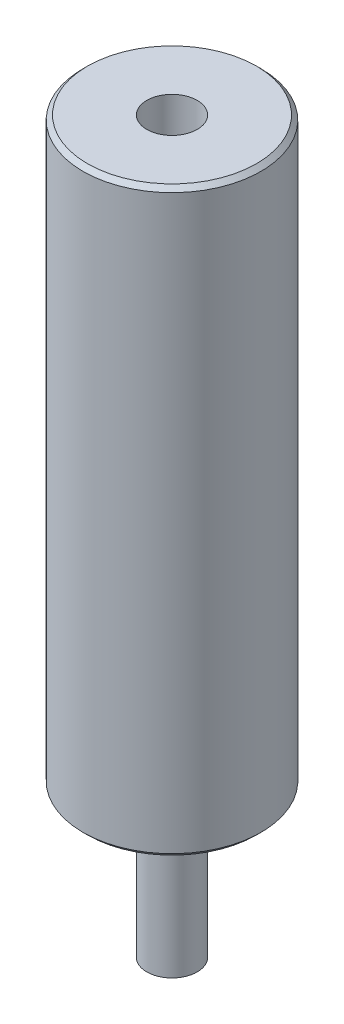
ISO-10303-21;
HEADER;
FILE_DESCRIPTION(('STEP AP214'),'2;1');
FILE_NAME('part.step','',(''),(''),'','','');
FILE_SCHEMA(('AUTOMOTIVE_DESIGN { 1 0 10303 214 1 1 1 1 }'));
ENDSEC;
DATA;
#1=APPLICATION_CONTEXT('core data for automotive mechanical design processes');
#2=APPLICATION_PROTOCOL_DEFINITION('international standard','automotive_design',2000,#1);
#3=PRODUCT_CONTEXT('',#1,'mechanical');
#4=PRODUCT('Part','Part','',(#3));
#5=PRODUCT_RELATED_PRODUCT_CATEGORY('part','',(#4));
#6=PRODUCT_DEFINITION_FORMATION('','',#4);
#7=PRODUCT_DEFINITION_CONTEXT('part definition',#1,'design');
#8=PRODUCT_DEFINITION('design','',#6,#7);
#9=PRODUCT_DEFINITION_SHAPE('','',#8);
#10=(LENGTH_UNIT() NAMED_UNIT(*) SI_UNIT(.MILLI.,.METRE.));
#11=(NAMED_UNIT(*) PLANE_ANGLE_UNIT() SI_UNIT($,.RADIAN.));
#12=(NAMED_UNIT(*) SI_UNIT($,.STERADIAN.) SOLID_ANGLE_UNIT());
#13=UNCERTAINTY_MEASURE_WITH_UNIT(LENGTH_MEASURE(1.E-05),#10,'distance_accuracy_value','');
#14=(GEOMETRIC_REPRESENTATION_CONTEXT(3) GLOBAL_UNCERTAINTY_ASSIGNED_CONTEXT((#13)) GLOBAL_UNIT_ASSIGNED_CONTEXT((#10,
#11,#12)) REPRESENTATION_CONTEXT('',''));
#15=CARTESIAN_POINT('',(0.,0.,0.));
#16=DIRECTION('',(0.,0.,1.));
#17=DIRECTION('',(1.,0.,0.));
#18=AXIS2_PLACEMENT_3D('',#15,#16,#17);
#19=CARTESIAN_POINT('',(-2.81055022886519E-11,-3.7833602629805E-11,0.));
#20=DIRECTION('',(0.,1.,0.));
#21=DIRECTION('',(0.,0.,1.));
#22=AXIS2_PLACEMENT_3D('',#19,#20,#21);
#23=CYLINDRICAL_SURFACE('',#22,1.7);
#24=CARTESIAN_POINT('',(-2.81055022886519E-11,-3.7833602629805E-11,0.));
#25=DIRECTION('',(0.,1.,0.));
#26=DIRECTION('',(0.,0.,1.));
#27=AXIS2_PLACEMENT_3D('',#24,#25,#26);
#28=CIRCLE('',#27,1.7);
#29=CARTESIAN_POINT('',(-2.81055022886519E-11,-3.7833602629805E-11,1.7));
#30=VERTEX_POINT('',#29);
#31=EDGE_CURVE('E62',#30,#30,#28,.T.);
#32=ORIENTED_EDGE('',*,*,#31,.T.);
#33=EDGE_LOOP('',(#32));
#34=FACE_BOUND('',#33,.T.);
#35=CARTESIAN_POINT('',(-2.81055022886519E-11,9.49999999996217,0.));
#36=DIRECTION('',(0.,1.,0.));
#37=DIRECTION('',(0.,0.,1.));
#38=AXIS2_PLACEMENT_3D('',#35,#36,#37);
#39=CIRCLE('',#38,1.7);
#40=CARTESIAN_POINT('',(-2.81055022886519E-11,9.49999999996217,1.7));
#41=VERTEX_POINT('',#40);
#42=EDGE_CURVE('E10',#41,#41,#39,.T.);
#43=ORIENTED_EDGE('',*,*,#42,.F.);
#44=EDGE_LOOP('',(#43));
#45=FACE_BOUND('',#44,.T.);
#46=ADVANCED_FACE('F31',(#34,#45),#23,.T.);
#47=CARTESIAN_POINT('',(-2.81055560769072E-11,9.49999999996217,0.));
#48=DIRECTION('',(0.,1.,0.));
#49=DIRECTION('',(0.,0.,1.));
#50=AXIS2_PLACEMENT_3D('',#47,#48,#49);
#51=TOROIDAL_SURFACE('',#50,2.2,0.5);
#52=ORIENTED_EDGE('',*,*,#42,.T.);
#53=EDGE_LOOP('',(#52));
#54=FACE_BOUND('',#53,.T.);
#55=CARTESIAN_POINT('',(-2.81055022886519E-11,9.99999999996217,0.));
#56=DIRECTION('',(0.,1.,0.));
#57=DIRECTION('',(0.,0.,1.));
#58=AXIS2_PLACEMENT_3D('',#55,#56,#57);
#59=CIRCLE('',#58,2.2);
#60=CARTESIAN_POINT('',(-2.81055022886519E-11,9.99999999996217,2.2));
#61=VERTEX_POINT('',#60);
#62=EDGE_CURVE('E37',#61,#61,#59,.T.);
#63=ORIENTED_EDGE('',*,*,#62,.F.);
#64=EDGE_LOOP('',(#63));
#65=FACE_BOUND('',#64,.T.);
#66=ADVANCED_FACE('F79',(#54,#65),#51,.F.);
#67=CARTESIAN_POINT('',(5.69999999996217,9.99999999996217,0.));
#68=DIRECTION('',(0.,-1.,0.));
#69=DIRECTION('',(0.,0.,-1.));
#70=AXIS2_PLACEMENT_3D('',#67,#68,#69);
#71=PLANE('',#70);
#72=ORIENTED_EDGE('',*,*,#62,.T.);
#73=EDGE_LOOP('',(#72));
#74=FACE_BOUND('',#73,.T.);
#75=CARTESIAN_POINT('',(-2.81055022886519E-11,9.99999999996217,0.));
#76=DIRECTION('',(0.,1.,0.));
#77=DIRECTION('',(0.,0.,1.));
#78=AXIS2_PLACEMENT_3D('',#75,#76,#77);
#79=CIRCLE('',#78,5.69999999999027);
#80=CARTESIAN_POINT('',(-2.81055022886519E-11,9.99999999996217,5.69999999999027));
#81=VERTEX_POINT('',#80);
#82=EDGE_CURVE('E41',#81,#81,#79,.T.);
#83=ORIENTED_EDGE('',*,*,#82,.F.);
#84=EDGE_LOOP('',(#83));
#85=FACE_BOUND('',#84,.T.);
#86=ADVANCED_FACE('F83',(#74,#85),#71,.T.);
#87=CARTESIAN_POINT('',(-2.81055022886519E-11,10.3,0.));
#88=DIRECTION('',(0.,1.,0.));
#89=DIRECTION('',(0.,0.,1.));
#90=AXIS2_PLACEMENT_3D('',#87,#88,#89);
#91=CONICAL_SURFACE('',#90,6.00000000002811,0.785398163397448);
#92=ORIENTED_EDGE('',*,*,#82,.T.);
#93=EDGE_LOOP('',(#92));
#94=FACE_BOUND('',#93,.T.);
#95=CARTESIAN_POINT('',(-2.81055022886519E-11,10.3,0.));
#96=DIRECTION('',(0.,1.,0.));
#97=DIRECTION('',(0.,0.,1.));
#98=AXIS2_PLACEMENT_3D('',#95,#96,#97);
#99=CIRCLE('',#98,6.00000000002811);
#100=CARTESIAN_POINT('',(-2.81055022886519E-11,10.3,6.00000000002811));
#101=VERTEX_POINT('',#100);
#102=EDGE_CURVE('E45',#101,#101,#99,.T.);
#103=ORIENTED_EDGE('',*,*,#102,.F.);
#104=EDGE_LOOP('',(#103));
#105=FACE_BOUND('',#104,.T.);
#106=ADVANCED_FACE('F87',(#94,#105),#91,.T.);
#107=CARTESIAN_POINT('',(-2.81055022886519E-11,-3.7833602629805E-11,0.));
#108=DIRECTION('',(0.,1.,0.));
#109=DIRECTION('',(0.,0.,1.));
#110=AXIS2_PLACEMENT_3D('',#107,#108,#109);
#111=CYLINDRICAL_SURFACE('',#110,6.00000000002811);
#112=ORIENTED_EDGE('',*,*,#102,.T.);
#113=EDGE_LOOP('',(#112));
#114=FACE_BOUND('',#113,.T.);
#115=CARTESIAN_POINT('',(-2.81055022886519E-11,48.9,0.));
#116=DIRECTION('',(0.,1.,0.));
#117=DIRECTION('',(0.,0.,1.));
#118=AXIS2_PLACEMENT_3D('',#115,#116,#117);
#119=CIRCLE('',#118,6.00000000002811);
#120=CARTESIAN_POINT('',(-2.81055022886519E-11,48.9,6.00000000002811));
#121=VERTEX_POINT('',#120);
#122=EDGE_CURVE('E50',#121,#121,#119,.T.);
#123=ORIENTED_EDGE('',*,*,#122,.F.);
#124=EDGE_LOOP('',(#123));
#125=FACE_BOUND('',#124,.T.);
#126=ADVANCED_FACE('F93',(#114,#125),#111,.T.);
#127=CARTESIAN_POINT('',(-2.81055022886519E-11,49.2000000000257,0.));
#128=DIRECTION('',(0.,-1.,0.));
#129=DIRECTION('',(0.,0.,-1.));
#130=AXIS2_PLACEMENT_3D('',#127,#128,#129);
#131=CONICAL_SURFACE('',#130,5.70000000000241,0.785398163397441);
#132=ORIENTED_EDGE('',*,*,#122,.T.);
#133=EDGE_LOOP('',(#132));
#134=FACE_BOUND('',#133,.T.);
#135=CARTESIAN_POINT('',(-2.81055022886519E-11,49.2000000000257,0.));
#136=DIRECTION('',(0.,1.,0.));
#137=DIRECTION('',(0.,0.,1.));
#138=AXIS2_PLACEMENT_3D('',#135,#136,#137);
#139=CIRCLE('',#138,5.70000000000241);
#140=CARTESIAN_POINT('',(-2.81055022886519E-11,49.2000000000257,5.70000000000241));
#141=VERTEX_POINT('',#140);
#142=EDGE_CURVE('E53',#141,#141,#139,.T.);
#143=ORIENTED_EDGE('',*,*,#142,.F.);
#144=EDGE_LOOP('',(#143));
#145=FACE_BOUND('',#144,.T.);
#146=ADVANCED_FACE('F97',(#134,#145),#131,.T.);
#147=CARTESIAN_POINT('',(1.6999999999719,49.2000000000257,0.));
#148=DIRECTION('',(0.,1.,0.));
#149=DIRECTION('',(0.,0.,1.));
#150=AXIS2_PLACEMENT_3D('',#147,#148,#149);
#151=PLANE('',#150);
#152=ORIENTED_EDGE('',*,*,#142,.T.);
#153=EDGE_LOOP('',(#152));
#154=FACE_BOUND('',#153,.T.);
#155=CARTESIAN_POINT('',(-2.81055022886519E-11,49.2000000000257,0.));
#156=DIRECTION('',(0.,1.,0.));
#157=DIRECTION('',(0.,0.,1.));
#158=AXIS2_PLACEMENT_3D('',#155,#156,#157);
#159=CIRCLE('',#158,1.7);
#160=CARTESIAN_POINT('',(-2.81055022886519E-11,49.2000000000257,1.7));
#161=VERTEX_POINT('',#160);
#162=EDGE_CURVE('E56',#161,#161,#159,.T.);
#163=ORIENTED_EDGE('',*,*,#162,.F.);
#164=EDGE_LOOP('',(#163));
#165=FACE_BOUND('',#164,.T.);
#166=ADVANCED_FACE('F101',(#154,#165),#151,.T.);
#167=CARTESIAN_POINT('',(-2.81055022886519E-11,-3.7833602629805E-11,0.));
#168=DIRECTION('',(0.,1.,0.));
#169=DIRECTION('',(0.,0.,1.));
#170=AXIS2_PLACEMENT_3D('',#167,#168,#169);
#171=CYLINDRICAL_SURFACE('',#170,1.7);
#172=ORIENTED_EDGE('',*,*,#162,.T.);
#173=EDGE_LOOP('',(#172));
#174=FACE_BOUND('',#173,.T.);
#175=CARTESIAN_POINT('',(-2.81055022886519E-11,39.1999999999622,0.));
#176=DIRECTION('',(0.,1.,0.));
#177=DIRECTION('',(0.,0.,1.));
#178=AXIS2_PLACEMENT_3D('',#175,#176,#177);
#179=CIRCLE('',#178,1.7);
#180=CARTESIAN_POINT('',(-2.81055022886519E-11,39.1999999999622,1.7));
#181=VERTEX_POINT('',#180);
#182=EDGE_CURVE('E59',#181,#181,#179,.T.);
#183=ORIENTED_EDGE('',*,*,#182,.F.);
#184=EDGE_LOOP('',(#183));
#185=FACE_BOUND('',#184,.T.);
#186=ADVANCED_FACE('F75',(#174,#185),#171,.F.);
#187=CARTESIAN_POINT('',(-2.81055022886519E-11,39.1999999999622,0.));
#188=DIRECTION('',(0.,1.,0.));
#189=DIRECTION('',(0.,0.,1.));
#190=AXIS2_PLACEMENT_3D('',#187,#188,#189);
#191=PLANE('',#190);
#192=ORIENTED_EDGE('',*,*,#182,.T.);
#193=EDGE_LOOP('',(#192));
#194=FACE_BOUND('',#193,.T.);
#195=ADVANCED_FACE('F70',(#194),#191,.T.);
#196=CARTESIAN_POINT('',(1.69999999997189,-3.7833602629805E-11,0.));
#197=DIRECTION('',(0.,-1.,0.));
#198=DIRECTION('',(0.,0.,-1.));
#199=AXIS2_PLACEMENT_3D('',#196,#197,#198);
#200=PLANE('',#199);
#201=ORIENTED_EDGE('',*,*,#31,.F.);
#202=EDGE_LOOP('',(#201));
#203=FACE_BOUND('',#202,.T.);
#204=ADVANCED_FACE('F68',(#203),#200,.T.);
#205=CLOSED_SHELL('',(#46,#66,#86,#106,#126,#146,#166,#186,#195,#204));
#206=MANIFOLD_SOLID_BREP('B2',#205);
#207=ADVANCED_BREP_SHAPE_REPRESENTATION('',(#18,#206),#14);
#208=SHAPE_DEFINITION_REPRESENTATION(#9,#207);
ENDSEC;
END-ISO-10303-21;
